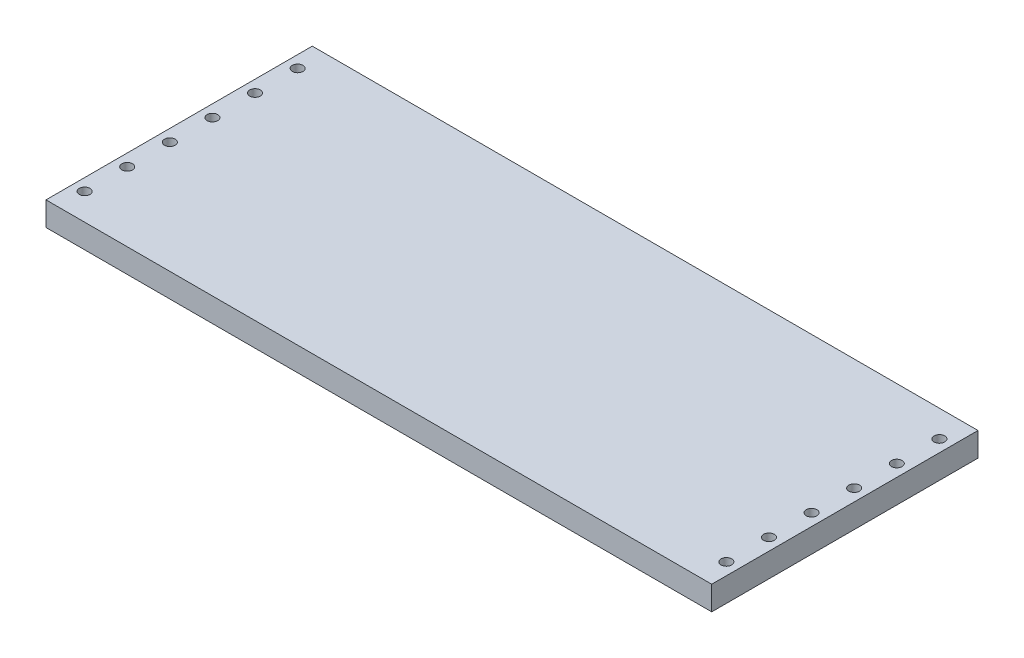
ISO-10303-21;
HEADER;
FILE_DESCRIPTION(('STEP AP214'),'2;1');
FILE_NAME('part.step','',(''),(''),'','','');
FILE_SCHEMA(('AUTOMOTIVE_DESIGN { 1 0 10303 214 1 1 1 1 }'));
ENDSEC;
DATA;
#1=APPLICATION_CONTEXT('core data for automotive mechanical design processes');
#2=APPLICATION_PROTOCOL_DEFINITION('international standard','automotive_design',2000,#1);
#3=PRODUCT_CONTEXT('',#1,'mechanical');
#4=PRODUCT('Part','Part','',(#3));
#5=PRODUCT_RELATED_PRODUCT_CATEGORY('part','',(#4));
#6=PRODUCT_DEFINITION_FORMATION('','',#4);
#7=PRODUCT_DEFINITION_CONTEXT('part definition',#1,'design');
#8=PRODUCT_DEFINITION('design','',#6,#7);
#9=PRODUCT_DEFINITION_SHAPE('','',#8);
#10=(LENGTH_UNIT() NAMED_UNIT(*) SI_UNIT(.MILLI.,.METRE.));
#11=(NAMED_UNIT(*) PLANE_ANGLE_UNIT() SI_UNIT($,.RADIAN.));
#12=(NAMED_UNIT(*) SI_UNIT($,.STERADIAN.) SOLID_ANGLE_UNIT());
#13=UNCERTAINTY_MEASURE_WITH_UNIT(LENGTH_MEASURE(1.E-05),#10,'distance_accuracy_value','');
#14=(GEOMETRIC_REPRESENTATION_CONTEXT(3) GLOBAL_UNCERTAINTY_ASSIGNED_CONTEXT((#13)) GLOBAL_UNIT_ASSIGNED_CONTEXT((#10,
#11,#12)) REPRESENTATION_CONTEXT('',''));
#15=CARTESIAN_POINT('',(0.,0.,0.));
#16=DIRECTION('',(0.,0.,1.));
#17=DIRECTION('',(1.,0.,0.));
#18=AXIS2_PLACEMENT_3D('',#15,#16,#17);
#19=CARTESIAN_POINT('',(0.,18.,0.));
#20=DIRECTION('',(1.,0.,0.));
#21=DIRECTION('',(0.,0.,-1.));
#22=AXIS2_PLACEMENT_3D('',#19,#20,#21);
#23=PLANE('',#22);
#24=DIRECTION('',(0.,0.,1.));
#25=VECTOR('',#24,1.);
#26=CARTESIAN_POINT('',(0.,0.,0.));
#27=LINE('',#26,#25);
#28=CARTESIAN_POINT('',(0.,0.,-200.));
#29=VERTEX_POINT('',#28);
#30=CARTESIAN_POINT('',(0.,0.,0.));
#31=VERTEX_POINT('',#30);
#32=EDGE_CURVE('E95',#29,#31,#27,.T.);
#33=ORIENTED_EDGE('',*,*,#32,.T.);
#34=DIRECTION('',(0.,-1.,0.));
#35=VECTOR('',#34,1.);
#36=CARTESIAN_POINT('',(0.,18.,0.));
#37=LINE('',#36,#35);
#38=CARTESIAN_POINT('',(0.,18.,0.));
#39=VERTEX_POINT('',#38);
#40=EDGE_CURVE('E11',#39,#31,#37,.T.);
#41=ORIENTED_EDGE('',*,*,#40,.F.);
#42=DIRECTION('',(0.,0.,1.));
#43=VECTOR('',#42,1.);
#44=CARTESIAN_POINT('',(0.,18.,0.));
#45=LINE('',#44,#43);
#46=CARTESIAN_POINT('',(0.,18.,-200.));
#47=VERTEX_POINT('',#46);
#48=EDGE_CURVE('E83',#47,#39,#45,.T.);
#49=ORIENTED_EDGE('',*,*,#48,.F.);
#50=DIRECTION('',(0.,-1.,0.));
#51=VECTOR('',#50,1.);
#52=CARTESIAN_POINT('',(0.,18.,-200.));
#53=LINE('',#52,#51);
#54=EDGE_CURVE('E91',#47,#29,#53,.T.);
#55=ORIENTED_EDGE('',*,*,#54,.T.);
#56=EDGE_LOOP('',(#33,#41,#49,#55));
#57=FACE_BOUND('',#56,.T.);
#58=ADVANCED_FACE('F32',(#57),#23,.F.);
#59=CARTESIAN_POINT('',(0.,18.,0.));
#60=DIRECTION('',(0.,0.,-1.));
#61=DIRECTION('',(-1.,0.,0.));
#62=AXIS2_PLACEMENT_3D('',#59,#60,#61);
#63=PLANE('',#62);
#64=DIRECTION('',(1.,0.,0.));
#65=VECTOR('',#64,1.);
#66=CARTESIAN_POINT('',(0.,0.,0.));
#67=LINE('',#66,#65);
#68=CARTESIAN_POINT('',(500.,0.,0.));
#69=VERTEX_POINT('',#68);
#70=EDGE_CURVE('E87',#31,#69,#67,.T.);
#71=ORIENTED_EDGE('',*,*,#70,.T.);
#72=DIRECTION('',(0.,-1.,0.));
#73=VECTOR('',#72,1.);
#74=CARTESIAN_POINT('',(500.,18.,0.));
#75=LINE('',#74,#73);
#76=CARTESIAN_POINT('',(500.,18.,0.));
#77=VERTEX_POINT('',#76);
#78=EDGE_CURVE('E40',#77,#69,#75,.T.);
#79=ORIENTED_EDGE('',*,*,#78,.F.);
#80=DIRECTION('',(1.,0.,0.));
#81=VECTOR('',#80,1.);
#82=CARTESIAN_POINT('',(0.,18.,0.));
#83=LINE('',#82,#81);
#84=EDGE_CURVE('E78',#39,#77,#83,.T.);
#85=ORIENTED_EDGE('',*,*,#84,.F.);
#86=ORIENTED_EDGE('',*,*,#40,.T.);
#87=EDGE_LOOP('',(#71,#79,#85,#86));
#88=FACE_BOUND('',#87,.T.);
#89=ADVANCED_FACE('F86',(#88),#63,.F.);
#90=CARTESIAN_POINT('',(500.,18.,0.));
#91=DIRECTION('',(-1.,0.,0.));
#92=DIRECTION('',(0.,0.,1.));
#93=AXIS2_PLACEMENT_3D('',#90,#91,#92);
#94=PLANE('',#93);
#95=DIRECTION('',(0.,0.,-1.));
#96=VECTOR('',#95,1.);
#97=CARTESIAN_POINT('',(500.,0.,0.));
#98=LINE('',#97,#96);
#99=CARTESIAN_POINT('',(500.,0.,-200.));
#100=VERTEX_POINT('',#99);
#101=EDGE_CURVE('E65',#69,#100,#98,.T.);
#102=ORIENTED_EDGE('',*,*,#101,.T.);
#103=DIRECTION('',(0.,-1.,0.));
#104=VECTOR('',#103,1.);
#105=CARTESIAN_POINT('',(500.,18.,-200.));
#106=LINE('',#105,#104);
#107=CARTESIAN_POINT('',(500.,18.,-200.));
#108=VERTEX_POINT('',#107);
#109=EDGE_CURVE('E88',#108,#100,#106,.T.);
#110=ORIENTED_EDGE('',*,*,#109,.F.);
#111=DIRECTION('',(0.,0.,-1.));
#112=VECTOR('',#111,1.);
#113=CARTESIAN_POINT('',(500.,18.,0.));
#114=LINE('',#113,#112);
#115=EDGE_CURVE('E81',#77,#108,#114,.T.);
#116=ORIENTED_EDGE('',*,*,#115,.F.);
#117=ORIENTED_EDGE('',*,*,#78,.T.);
#118=EDGE_LOOP('',(#102,#110,#116,#117));
#119=FACE_BOUND('',#118,.T.);
#120=ADVANCED_FACE('F89',(#119),#94,.F.);
#121=CARTESIAN_POINT('',(0.,18.,-200.));
#122=DIRECTION('',(0.,0.,1.));
#123=DIRECTION('',(1.,0.,0.));
#124=AXIS2_PLACEMENT_3D('',#121,#122,#123);
#125=PLANE('',#124);
#126=DIRECTION('',(-1.,0.,0.));
#127=VECTOR('',#126,1.);
#128=CARTESIAN_POINT('',(0.,0.,-200.));
#129=LINE('',#128,#127);
#130=EDGE_CURVE('E71',#100,#29,#129,.T.);
#131=ORIENTED_EDGE('',*,*,#130,.T.);
#132=ORIENTED_EDGE('',*,*,#54,.F.);
#133=DIRECTION('',(-1.,0.,0.));
#134=VECTOR('',#133,1.);
#135=CARTESIAN_POINT('',(0.,18.,-200.));
#136=LINE('',#135,#134);
#137=EDGE_CURVE('E48',#108,#47,#136,.T.);
#138=ORIENTED_EDGE('',*,*,#137,.F.);
#139=ORIENTED_EDGE('',*,*,#109,.T.);
#140=EDGE_LOOP('',(#131,#132,#138,#139));
#141=FACE_BOUND('',#140,.T.);
#142=ADVANCED_FACE('F103',(#141),#125,.F.);
#143=CARTESIAN_POINT('',(0.,18.,0.));
#144=DIRECTION('',(0.,-1.,0.));
#145=DIRECTION('',(0.,0.,-1.));
#146=AXIS2_PLACEMENT_3D('',#143,#144,#145);
#147=PLANE('',#146);
#148=CARTESIAN_POINT('',(490.999999999999,18.,-84.));
#149=DIRECTION('',(0.,1.,0.));
#150=DIRECTION('',(0.,0.,-1.));
#151=AXIS2_PLACEMENT_3D('',#148,#149,#150);
#152=CIRCLE('',#151,3.99999999999999);
#153=CARTESIAN_POINT('',(490.999999999999,18.,-88.));
#154=VERTEX_POINT('',#153);
#155=EDGE_CURVE('E139',#154,#154,#152,.T.);
#156=ORIENTED_EDGE('',*,*,#155,.F.);
#157=EDGE_LOOP('',(#156));
#158=FACE_BOUND('',#157,.T.);
#159=CARTESIAN_POINT('',(490.999999999998,18.,-52.));
#160=DIRECTION('',(0.,1.,0.));
#161=DIRECTION('',(0.,0.,-1.));
#162=AXIS2_PLACEMENT_3D('',#159,#160,#161);
#163=CIRCLE('',#162,3.99999999999999);
#164=CARTESIAN_POINT('',(490.999999999998,18.,-56.));
#165=VERTEX_POINT('',#164);
#166=EDGE_CURVE('E146',#165,#165,#163,.T.);
#167=ORIENTED_EDGE('',*,*,#166,.F.);
#168=EDGE_LOOP('',(#167));
#169=FACE_BOUND('',#168,.T.);
#170=CARTESIAN_POINT('',(490.999999999998,18.,-20.));
#171=DIRECTION('',(0.,1.,0.));
#172=DIRECTION('',(0.,0.,-1.));
#173=AXIS2_PLACEMENT_3D('',#170,#171,#172);
#174=CIRCLE('',#173,3.99999999999999);
#175=CARTESIAN_POINT('',(490.999999999998,18.,-24.));
#176=VERTEX_POINT('',#175);
#177=EDGE_CURVE('E152',#176,#176,#174,.T.);
#178=ORIENTED_EDGE('',*,*,#177,.F.);
#179=EDGE_LOOP('',(#178));
#180=FACE_BOUND('',#179,.T.);
#181=CARTESIAN_POINT('',(9.00000000000223,18.,-20.));
#182=DIRECTION('',(0.,1.,0.));
#183=DIRECTION('',(0.,0.,1.));
#184=AXIS2_PLACEMENT_3D('',#181,#182,#183);
#185=CIRCLE('',#184,4.);
#186=CARTESIAN_POINT('',(9.00000000000223,18.,-16.));
#187=VERTEX_POINT('',#186);
#188=EDGE_CURVE('E158',#187,#187,#185,.T.);
#189=ORIENTED_EDGE('',*,*,#188,.F.);
#190=EDGE_LOOP('',(#189));
#191=FACE_BOUND('',#190,.T.);
#192=CARTESIAN_POINT('',(9.00000000000179,18.,-52.));
#193=DIRECTION('',(0.,1.,0.));
#194=DIRECTION('',(0.,0.,1.));
#195=AXIS2_PLACEMENT_3D('',#192,#193,#194);
#196=CIRCLE('',#195,4.);
#197=CARTESIAN_POINT('',(9.00000000000179,18.,-48.));
#198=VERTEX_POINT('',#197);
#199=EDGE_CURVE('E115',#198,#198,#196,.T.);
#200=ORIENTED_EDGE('',*,*,#199,.F.);
#201=EDGE_LOOP('',(#200));
#202=FACE_BOUND('',#201,.T.);
#203=CARTESIAN_POINT('',(9.00000000000134,18.,-84.));
#204=DIRECTION('',(0.,1.,0.));
#205=DIRECTION('',(0.,0.,1.));
#206=AXIS2_PLACEMENT_3D('',#203,#204,#205);
#207=CIRCLE('',#206,4.);
#208=CARTESIAN_POINT('',(9.00000000000134,18.,-80.));
#209=VERTEX_POINT('',#208);
#210=EDGE_CURVE('E122',#209,#209,#207,.T.);
#211=ORIENTED_EDGE('',*,*,#210,.F.);
#212=EDGE_LOOP('',(#211));
#213=FACE_BOUND('',#212,.T.);
#214=CARTESIAN_POINT('',(9.00000000000089,18.,-116.));
#215=DIRECTION('',(0.,1.,0.));
#216=DIRECTION('',(0.,0.,1.));
#217=AXIS2_PLACEMENT_3D('',#214,#215,#216);
#218=CIRCLE('',#217,4.);
#219=CARTESIAN_POINT('',(9.00000000000089,18.,-112.));
#220=VERTEX_POINT('',#219);
#221=EDGE_CURVE('E128',#220,#220,#218,.T.);
#222=ORIENTED_EDGE('',*,*,#221,.F.);
#223=EDGE_LOOP('',(#222));
#224=FACE_BOUND('',#223,.T.);
#225=CARTESIAN_POINT('',(9.00000000000045,18.,-148.));
#226=DIRECTION('',(0.,1.,0.));
#227=DIRECTION('',(0.,0.,1.));
#228=AXIS2_PLACEMENT_3D('',#225,#226,#227);
#229=CIRCLE('',#228,4.);
#230=CARTESIAN_POINT('',(9.00000000000045,18.,-144.));
#231=VERTEX_POINT('',#230);
#232=EDGE_CURVE('E134',#231,#231,#229,.T.);
#233=ORIENTED_EDGE('',*,*,#232,.F.);
#234=EDGE_LOOP('',(#233));
#235=FACE_BOUND('',#234,.T.);
#236=CARTESIAN_POINT('',(490.999999999999,18.,-116.));
#237=DIRECTION('',(0.,1.,0.));
#238=DIRECTION('',(0.,0.,-1.));
#239=AXIS2_PLACEMENT_3D('',#236,#237,#238);
#240=CIRCLE('',#239,3.99999999999999);
#241=CARTESIAN_POINT('',(490.999999999999,18.,-120.));
#242=VERTEX_POINT('',#241);
#243=EDGE_CURVE('E175',#242,#242,#240,.T.);
#244=ORIENTED_EDGE('',*,*,#243,.F.);
#245=EDGE_LOOP('',(#244));
#246=FACE_BOUND('',#245,.T.);
#247=CARTESIAN_POINT('',(491.,18.,-148.));
#248=DIRECTION('',(0.,1.,0.));
#249=DIRECTION('',(0.,0.,-1.));
#250=AXIS2_PLACEMENT_3D('',#247,#248,#249);
#251=CIRCLE('',#250,3.99999999999999);
#252=CARTESIAN_POINT('',(491.,18.,-152.));
#253=VERTEX_POINT('',#252);
#254=EDGE_CURVE('E169',#253,#253,#251,.T.);
#255=ORIENTED_EDGE('',*,*,#254,.F.);
#256=EDGE_LOOP('',(#255));
#257=FACE_BOUND('',#256,.T.);
#258=CARTESIAN_POINT('',(491.,18.,-180.));
#259=DIRECTION('',(0.,1.,0.));
#260=DIRECTION('',(0.,0.,-1.));
#261=AXIS2_PLACEMENT_3D('',#258,#259,#260);
#262=CIRCLE('',#261,3.99999999999999);
#263=CARTESIAN_POINT('',(491.,18.,-184.));
#264=VERTEX_POINT('',#263);
#265=EDGE_CURVE('E163',#264,#264,#262,.T.);
#266=ORIENTED_EDGE('',*,*,#265,.F.);
#267=EDGE_LOOP('',(#266));
#268=FACE_BOUND('',#267,.T.);
#269=CARTESIAN_POINT('',(9.,18.,-180.));
#270=DIRECTION('',(0.,1.,0.));
#271=DIRECTION('',(0.,0.,1.));
#272=AXIS2_PLACEMENT_3D('',#269,#270,#271);
#273=CIRCLE('',#272,4.);
#274=CARTESIAN_POINT('',(9.,18.,-176.));
#275=VERTEX_POINT('',#274);
#276=EDGE_CURVE('E109',#275,#275,#273,.T.);
#277=ORIENTED_EDGE('',*,*,#276,.F.);
#278=EDGE_LOOP('',(#277));
#279=FACE_BOUND('',#278,.T.);
#280=ORIENTED_EDGE('',*,*,#48,.T.);
#281=ORIENTED_EDGE('',*,*,#84,.T.);
#282=ORIENTED_EDGE('',*,*,#115,.T.);
#283=ORIENTED_EDGE('',*,*,#137,.T.);
#284=EDGE_LOOP('',(#280,#281,#282,#283));
#285=FACE_BOUND('',#284,.T.);
#286=ADVANCED_FACE('F79',(#158,#169,#180,#191,#202,#213,#224,#235,#246,#257,#268,#279,#285),
#147,.F.);
#287=CARTESIAN_POINT('',(0.,0.,0.));
#288=DIRECTION('',(0.,-1.,0.));
#289=DIRECTION('',(0.,0.,-1.));
#290=AXIS2_PLACEMENT_3D('',#287,#288,#289);
#291=PLANE('',#290);
#292=ORIENTED_EDGE('',*,*,#32,.F.);
#293=ORIENTED_EDGE('',*,*,#130,.F.);
#294=ORIENTED_EDGE('',*,*,#101,.F.);
#295=ORIENTED_EDGE('',*,*,#70,.F.);
#296=EDGE_LOOP('',(#292,#293,#294,#295));
#297=FACE_BOUND('',#296,.T.);
#298=ADVANCED_FACE('F106',(#297),#291,.T.);
#299=CARTESIAN_POINT('',(9.,8.,-180.));
#300=DIRECTION('',(0.,1.,0.));
#301=DIRECTION('',(0.,0.,1.));
#302=AXIS2_PLACEMENT_3D('',#299,#300,#301);
#303=CYLINDRICAL_SURFACE('',#302,4.);
#304=CARTESIAN_POINT('',(9.,8.,-180.));
#305=DIRECTION('',(0.,1.,0.));
#306=DIRECTION('',(0.,0.,1.));
#307=AXIS2_PLACEMENT_3D('',#304,#305,#306);
#308=CIRCLE('',#307,4.);
#309=CARTESIAN_POINT('',(9.,8.,-176.));
#310=VERTEX_POINT('',#309);
#311=EDGE_CURVE('E98',#310,#310,#308,.T.);
#312=ORIENTED_EDGE('',*,*,#311,.F.);
#313=EDGE_LOOP('',(#312));
#314=FACE_BOUND('',#313,.T.);
#315=ORIENTED_EDGE('',*,*,#276,.T.);
#316=EDGE_LOOP('',(#315));
#317=FACE_BOUND('',#316,.T.);
#318=ADVANCED_FACE('F200',(#314,#317),#303,.F.);
#319=CARTESIAN_POINT('',(9.,8.,-180.));
#320=DIRECTION('',(0.,1.,0.));
#321=DIRECTION('',(0.,0.,1.));
#322=AXIS2_PLACEMENT_3D('',#319,#320,#321);
#323=PLANE('',#322);
#324=ORIENTED_EDGE('',*,*,#311,.T.);
#325=EDGE_LOOP('',(#324));
#326=FACE_BOUND('',#325,.T.);
#327=ADVANCED_FACE('F202',(#326),#323,.T.);
#328=CARTESIAN_POINT('',(491.,8.,-180.));
#329=DIRECTION('',(0.,1.,0.));
#330=DIRECTION('',(0.,0.,1.));
#331=AXIS2_PLACEMENT_3D('',#328,#329,#330);
#332=CYLINDRICAL_SURFACE('',#331,3.99999999999999);
#333=CARTESIAN_POINT('',(491.,8.,-180.));
#334=DIRECTION('',(0.,1.,0.));
#335=DIRECTION('',(0.,0.,-1.));
#336=AXIS2_PLACEMENT_3D('',#333,#334,#335);
#337=CIRCLE('',#336,3.99999999999999);
#338=CARTESIAN_POINT('',(491.,8.,-184.));
#339=VERTEX_POINT('',#338);
#340=EDGE_CURVE('E166',#339,#339,#337,.T.);
#341=ORIENTED_EDGE('',*,*,#340,.F.);
#342=EDGE_LOOP('',(#341));
#343=FACE_BOUND('',#342,.T.);
#344=ORIENTED_EDGE('',*,*,#265,.T.);
#345=EDGE_LOOP('',(#344));
#346=FACE_BOUND('',#345,.T.);
#347=ADVANCED_FACE('F209',(#343,#346),#332,.F.);
#348=CARTESIAN_POINT('',(491.,8.,-180.));
#349=DIRECTION('',(0.,-1.,0.));
#350=DIRECTION('',(0.,0.,-1.));
#351=AXIS2_PLACEMENT_3D('',#348,#349,#350);
#352=PLANE('',#351);
#353=ORIENTED_EDGE('',*,*,#340,.T.);
#354=EDGE_LOOP('',(#353));
#355=FACE_BOUND('',#354,.T.);
#356=ADVANCED_FACE('F257',(#355),#352,.F.);
#357=CARTESIAN_POINT('',(491.,8.,-148.));
#358=DIRECTION('',(0.,1.,0.));
#359=DIRECTION('',(0.,0.,1.));
#360=AXIS2_PLACEMENT_3D('',#357,#358,#359);
#361=CYLINDRICAL_SURFACE('',#360,3.99999999999999);
#362=CARTESIAN_POINT('',(491.,8.,-148.));
#363=DIRECTION('',(0.,1.,0.));
#364=DIRECTION('',(0.,0.,-1.));
#365=AXIS2_PLACEMENT_3D('',#362,#363,#364);
#366=CIRCLE('',#365,3.99999999999999);
#367=CARTESIAN_POINT('',(491.,8.,-152.));
#368=VERTEX_POINT('',#367);
#369=EDGE_CURVE('E172',#368,#368,#366,.T.);
#370=ORIENTED_EDGE('',*,*,#369,.F.);
#371=EDGE_LOOP('',(#370));
#372=FACE_BOUND('',#371,.T.);
#373=ORIENTED_EDGE('',*,*,#254,.T.);
#374=EDGE_LOOP('',(#373));
#375=FACE_BOUND('',#374,.T.);
#376=ADVANCED_FACE('F266',(#372,#375),#361,.F.);
#377=CARTESIAN_POINT('',(491.,8.,-148.));
#378=DIRECTION('',(0.,-1.,0.));
#379=DIRECTION('',(0.,0.,-1.));
#380=AXIS2_PLACEMENT_3D('',#377,#378,#379);
#381=PLANE('',#380);
#382=ORIENTED_EDGE('',*,*,#369,.T.);
#383=EDGE_LOOP('',(#382));
#384=FACE_BOUND('',#383,.T.);
#385=ADVANCED_FACE('F186',(#384),#381,.F.);
#386=CARTESIAN_POINT('',(490.999999999999,8.,-116.));
#387=DIRECTION('',(0.,1.,0.));
#388=DIRECTION('',(0.,0.,1.));
#389=AXIS2_PLACEMENT_3D('',#386,#387,#388);
#390=CYLINDRICAL_SURFACE('',#389,3.99999999999999);
#391=CARTESIAN_POINT('',(490.999999999999,8.,-116.));
#392=DIRECTION('',(0.,1.,0.));
#393=DIRECTION('',(0.,0.,-1.));
#394=AXIS2_PLACEMENT_3D('',#391,#392,#393);
#395=CIRCLE('',#394,3.99999999999999);
#396=CARTESIAN_POINT('',(490.999999999999,8.,-120.));
#397=VERTEX_POINT('',#396);
#398=EDGE_CURVE('E143',#397,#397,#395,.T.);
#399=ORIENTED_EDGE('',*,*,#398,.F.);
#400=EDGE_LOOP('',(#399));
#401=FACE_BOUND('',#400,.T.);
#402=ORIENTED_EDGE('',*,*,#243,.T.);
#403=EDGE_LOOP('',(#402));
#404=FACE_BOUND('',#403,.T.);
#405=ADVANCED_FACE('F183',(#401,#404),#390,.F.);
#406=CARTESIAN_POINT('',(490.999999999999,8.,-116.));
#407=DIRECTION('',(0.,-1.,0.));
#408=DIRECTION('',(0.,0.,-1.));
#409=AXIS2_PLACEMENT_3D('',#406,#407,#408);
#410=PLANE('',#409);
#411=ORIENTED_EDGE('',*,*,#398,.T.);
#412=EDGE_LOOP('',(#411));
#413=FACE_BOUND('',#412,.T.);
#414=ADVANCED_FACE('F181',(#413),#410,.F.);
#415=CARTESIAN_POINT('',(9.00000000000045,8.,-148.));
#416=DIRECTION('',(0.,1.,0.));
#417=DIRECTION('',(0.,0.,1.));
#418=AXIS2_PLACEMENT_3D('',#415,#416,#417);
#419=CYLINDRICAL_SURFACE('',#418,4.);
#420=CARTESIAN_POINT('',(9.00000000000045,8.,-148.));
#421=DIRECTION('',(0.,1.,0.));
#422=DIRECTION('',(0.,0.,1.));
#423=AXIS2_PLACEMENT_3D('',#420,#421,#422);
#424=CIRCLE('',#423,4.);
#425=CARTESIAN_POINT('',(9.00000000000045,8.,-144.));
#426=VERTEX_POINT('',#425);
#427=EDGE_CURVE('E112',#426,#426,#424,.T.);
#428=ORIENTED_EDGE('',*,*,#427,.F.);
#429=EDGE_LOOP('',(#428));
#430=FACE_BOUND('',#429,.T.);
#431=ORIENTED_EDGE('',*,*,#232,.T.);
#432=EDGE_LOOP('',(#431));
#433=FACE_BOUND('',#432,.T.);
#434=ADVANCED_FACE('F296',(#430,#433),#419,.F.);
#435=CARTESIAN_POINT('',(9.00000000000045,8.,-148.));
#436=DIRECTION('',(0.,1.,0.));
#437=DIRECTION('',(0.,0.,1.));
#438=AXIS2_PLACEMENT_3D('',#435,#436,#437);
#439=PLANE('',#438);
#440=ORIENTED_EDGE('',*,*,#427,.T.);
#441=EDGE_LOOP('',(#440));
#442=FACE_BOUND('',#441,.T.);
#443=ADVANCED_FACE('F304',(#442),#439,.T.);
#444=CARTESIAN_POINT('',(9.00000000000089,8.,-116.));
#445=DIRECTION('',(0.,1.,0.));
#446=DIRECTION('',(0.,0.,1.));
#447=AXIS2_PLACEMENT_3D('',#444,#445,#446);
#448=CYLINDRICAL_SURFACE('',#447,4.);
#449=CARTESIAN_POINT('',(9.00000000000089,8.,-116.));
#450=DIRECTION('',(0.,1.,0.));
#451=DIRECTION('',(0.,0.,1.));
#452=AXIS2_PLACEMENT_3D('',#449,#450,#451);
#453=CIRCLE('',#452,4.);
#454=CARTESIAN_POINT('',(9.00000000000089,8.,-112.));
#455=VERTEX_POINT('',#454);
#456=EDGE_CURVE('E131',#455,#455,#453,.T.);
#457=ORIENTED_EDGE('',*,*,#456,.F.);
#458=EDGE_LOOP('',(#457));
#459=FACE_BOUND('',#458,.T.);
#460=ORIENTED_EDGE('',*,*,#221,.T.);
#461=EDGE_LOOP('',(#460));
#462=FACE_BOUND('',#461,.T.);
#463=ADVANCED_FACE('F313',(#459,#462),#448,.F.);
#464=CARTESIAN_POINT('',(9.00000000000089,8.,-116.));
#465=DIRECTION('',(0.,1.,0.));
#466=DIRECTION('',(0.,0.,1.));
#467=AXIS2_PLACEMENT_3D('',#464,#465,#466);
#468=PLANE('',#467);
#469=ORIENTED_EDGE('',*,*,#456,.T.);
#470=EDGE_LOOP('',(#469));
#471=FACE_BOUND('',#470,.T.);
#472=ADVANCED_FACE('F322',(#471),#468,.T.);
#473=CARTESIAN_POINT('',(9.00000000000134,8.,-84.));
#474=DIRECTION('',(0.,1.,0.));
#475=DIRECTION('',(0.,0.,1.));
#476=AXIS2_PLACEMENT_3D('',#473,#474,#475);
#477=CYLINDRICAL_SURFACE('',#476,4.);
#478=CARTESIAN_POINT('',(9.00000000000134,8.,-84.));
#479=DIRECTION('',(0.,1.,0.));
#480=DIRECTION('',(0.,0.,1.));
#481=AXIS2_PLACEMENT_3D('',#478,#479,#480);
#482=CIRCLE('',#481,4.);
#483=CARTESIAN_POINT('',(9.00000000000134,8.,-80.));
#484=VERTEX_POINT('',#483);
#485=EDGE_CURVE('E125',#484,#484,#482,.T.);
#486=ORIENTED_EDGE('',*,*,#485,.F.);
#487=EDGE_LOOP('',(#486));
#488=FACE_BOUND('',#487,.T.);
#489=ORIENTED_EDGE('',*,*,#210,.T.);
#490=EDGE_LOOP('',(#489));
#491=FACE_BOUND('',#490,.T.);
#492=ADVANCED_FACE('F331',(#488,#491),#477,.F.);
#493=CARTESIAN_POINT('',(9.00000000000134,8.,-84.));
#494=DIRECTION('',(0.,1.,0.));
#495=DIRECTION('',(0.,0.,1.));
#496=AXIS2_PLACEMENT_3D('',#493,#494,#495);
#497=PLANE('',#496);
#498=ORIENTED_EDGE('',*,*,#485,.T.);
#499=EDGE_LOOP('',(#498));
#500=FACE_BOUND('',#499,.T.);
#501=ADVANCED_FACE('F340',(#500),#497,.T.);
#502=CARTESIAN_POINT('',(9.00000000000179,8.,-52.));
#503=DIRECTION('',(0.,1.,0.));
#504=DIRECTION('',(0.,0.,1.));
#505=AXIS2_PLACEMENT_3D('',#502,#503,#504);
#506=CYLINDRICAL_SURFACE('',#505,4.);
#507=CARTESIAN_POINT('',(9.00000000000179,8.,-52.));
#508=DIRECTION('',(0.,1.,0.));
#509=DIRECTION('',(0.,0.,1.));
#510=AXIS2_PLACEMENT_3D('',#507,#508,#509);
#511=CIRCLE('',#510,4.);
#512=CARTESIAN_POINT('',(9.00000000000179,8.,-48.));
#513=VERTEX_POINT('',#512);
#514=EDGE_CURVE('E118',#513,#513,#511,.T.);
#515=ORIENTED_EDGE('',*,*,#514,.F.);
#516=EDGE_LOOP('',(#515));
#517=FACE_BOUND('',#516,.T.);
#518=ORIENTED_EDGE('',*,*,#199,.T.);
#519=EDGE_LOOP('',(#518));
#520=FACE_BOUND('',#519,.T.);
#521=ADVANCED_FACE('F349',(#517,#520),#506,.F.);
#522=CARTESIAN_POINT('',(9.00000000000179,8.,-52.));
#523=DIRECTION('',(0.,1.,0.));
#524=DIRECTION('',(0.,0.,1.));
#525=AXIS2_PLACEMENT_3D('',#522,#523,#524);
#526=PLANE('',#525);
#527=ORIENTED_EDGE('',*,*,#514,.T.);
#528=EDGE_LOOP('',(#527));
#529=FACE_BOUND('',#528,.T.);
#530=ADVANCED_FACE('F358',(#529),#526,.T.);
#531=CARTESIAN_POINT('',(9.00000000000223,8.,-20.));
#532=DIRECTION('',(0.,1.,0.));
#533=DIRECTION('',(0.,0.,1.));
#534=AXIS2_PLACEMENT_3D('',#531,#532,#533);
#535=CYLINDRICAL_SURFACE('',#534,4.);
#536=CARTESIAN_POINT('',(9.00000000000223,8.,-20.));
#537=DIRECTION('',(0.,1.,0.));
#538=DIRECTION('',(0.,0.,1.));
#539=AXIS2_PLACEMENT_3D('',#536,#537,#538);
#540=CIRCLE('',#539,4.);
#541=CARTESIAN_POINT('',(9.00000000000223,8.,-16.));
#542=VERTEX_POINT('',#541);
#543=EDGE_CURVE('E119',#542,#542,#540,.T.);
#544=ORIENTED_EDGE('',*,*,#543,.F.);
#545=EDGE_LOOP('',(#544));
#546=FACE_BOUND('',#545,.T.);
#547=ORIENTED_EDGE('',*,*,#188,.T.);
#548=EDGE_LOOP('',(#547));
#549=FACE_BOUND('',#548,.T.);
#550=ADVANCED_FACE('F367',(#546,#549),#535,.F.);
#551=CARTESIAN_POINT('',(9.00000000000223,8.,-20.));
#552=DIRECTION('',(0.,1.,0.));
#553=DIRECTION('',(0.,0.,1.));
#554=AXIS2_PLACEMENT_3D('',#551,#552,#553);
#555=PLANE('',#554);
#556=ORIENTED_EDGE('',*,*,#543,.T.);
#557=EDGE_LOOP('',(#556));
#558=FACE_BOUND('',#557,.T.);
#559=ADVANCED_FACE('F376',(#558),#555,.T.);
#560=CARTESIAN_POINT('',(490.999999999998,8.,-20.));
#561=DIRECTION('',(0.,1.,0.));
#562=DIRECTION('',(0.,0.,1.));
#563=AXIS2_PLACEMENT_3D('',#560,#561,#562);
#564=CYLINDRICAL_SURFACE('',#563,3.99999999999999);
#565=CARTESIAN_POINT('',(490.999999999998,8.,-20.));
#566=DIRECTION('',(0.,1.,0.));
#567=DIRECTION('',(0.,0.,-1.));
#568=AXIS2_PLACEMENT_3D('',#565,#566,#567);
#569=CIRCLE('',#568,3.99999999999999);
#570=CARTESIAN_POINT('',(490.999999999998,8.,-24.));
#571=VERTEX_POINT('',#570);
#572=EDGE_CURVE('E155',#571,#571,#569,.T.);
#573=ORIENTED_EDGE('',*,*,#572,.F.);
#574=EDGE_LOOP('',(#573));
#575=FACE_BOUND('',#574,.T.);
#576=ORIENTED_EDGE('',*,*,#177,.T.);
#577=EDGE_LOOP('',(#576));
#578=FACE_BOUND('',#577,.T.);
#579=ADVANCED_FACE('F385',(#575,#578),#564,.F.);
#580=CARTESIAN_POINT('',(490.999999999998,8.,-20.));
#581=DIRECTION('',(0.,-1.,0.));
#582=DIRECTION('',(0.,0.,-1.));
#583=AXIS2_PLACEMENT_3D('',#580,#581,#582);
#584=PLANE('',#583);
#585=ORIENTED_EDGE('',*,*,#572,.T.);
#586=EDGE_LOOP('',(#585));
#587=FACE_BOUND('',#586,.T.);
#588=ADVANCED_FACE('F394',(#587),#584,.F.);
#589=CARTESIAN_POINT('',(490.999999999998,8.,-52.));
#590=DIRECTION('',(0.,1.,0.));
#591=DIRECTION('',(0.,0.,1.));
#592=AXIS2_PLACEMENT_3D('',#589,#590,#591);
#593=CYLINDRICAL_SURFACE('',#592,3.99999999999999);
#594=CARTESIAN_POINT('',(490.999999999998,8.,-52.));
#595=DIRECTION('',(0.,1.,0.));
#596=DIRECTION('',(0.,0.,-1.));
#597=AXIS2_PLACEMENT_3D('',#594,#595,#596);
#598=CIRCLE('',#597,3.99999999999999);
#599=CARTESIAN_POINT('',(490.999999999998,8.,-56.));
#600=VERTEX_POINT('',#599);
#601=EDGE_CURVE('E149',#600,#600,#598,.T.);
#602=ORIENTED_EDGE('',*,*,#601,.F.);
#603=EDGE_LOOP('',(#602));
#604=FACE_BOUND('',#603,.T.);
#605=ORIENTED_EDGE('',*,*,#166,.T.);
#606=EDGE_LOOP('',(#605));
#607=FACE_BOUND('',#606,.T.);
#608=ADVANCED_FACE('F403',(#604,#607),#593,.F.);
#609=CARTESIAN_POINT('',(490.999999999998,8.,-52.));
#610=DIRECTION('',(0.,-1.,0.));
#611=DIRECTION('',(0.,0.,-1.));
#612=AXIS2_PLACEMENT_3D('',#609,#610,#611);
#613=PLANE('',#612);
#614=ORIENTED_EDGE('',*,*,#601,.T.);
#615=EDGE_LOOP('',(#614));
#616=FACE_BOUND('',#615,.T.);
#617=ADVANCED_FACE('F412',(#616),#613,.F.);
#618=CARTESIAN_POINT('',(490.999999999999,8.,-84.));
#619=DIRECTION('',(0.,1.,0.));
#620=DIRECTION('',(0.,0.,1.));
#621=AXIS2_PLACEMENT_3D('',#618,#619,#620);
#622=CYLINDRICAL_SURFACE('',#621,3.99999999999999);
#623=CARTESIAN_POINT('',(490.999999999999,8.,-84.));
#624=DIRECTION('',(0.,1.,0.));
#625=DIRECTION('',(0.,0.,-1.));
#626=AXIS2_PLACEMENT_3D('',#623,#624,#625);
#627=CIRCLE('',#626,3.99999999999999);
#628=CARTESIAN_POINT('',(490.999999999999,8.,-88.));
#629=VERTEX_POINT('',#628);
#630=EDGE_CURVE('E142',#629,#629,#627,.T.);
#631=ORIENTED_EDGE('',*,*,#630,.F.);
#632=EDGE_LOOP('',(#631));
#633=FACE_BOUND('',#632,.T.);
#634=ORIENTED_EDGE('',*,*,#155,.T.);
#635=EDGE_LOOP('',(#634));
#636=FACE_BOUND('',#635,.T.);
#637=ADVANCED_FACE('F421',(#633,#636),#622,.F.);
#638=CARTESIAN_POINT('',(490.999999999999,8.,-84.));
#639=DIRECTION('',(0.,-1.,0.));
#640=DIRECTION('',(0.,0.,-1.));
#641=AXIS2_PLACEMENT_3D('',#638,#639,#640);
#642=PLANE('',#641);
#643=ORIENTED_EDGE('',*,*,#630,.T.);
#644=EDGE_LOOP('',(#643));
#645=FACE_BOUND('',#644,.T.);
#646=ADVANCED_FACE('F430',(#645),#642,.F.);
#647=CLOSED_SHELL('',(#58,#89,#120,#142,#286,#298,#318,#327,#347,#356,#376,#385,#405,#414,#434,
#443,#463,#472,#492,#501,#521,#530,#550,#559,#579,#588,#608,#617,#637,#646));
#648=MANIFOLD_SOLID_BREP('B2',#647);
#649=ADVANCED_BREP_SHAPE_REPRESENTATION('',(#18,#648),#14);
#650=SHAPE_DEFINITION_REPRESENTATION(#9,#649);
ENDSEC;
END-ISO-10303-21;
